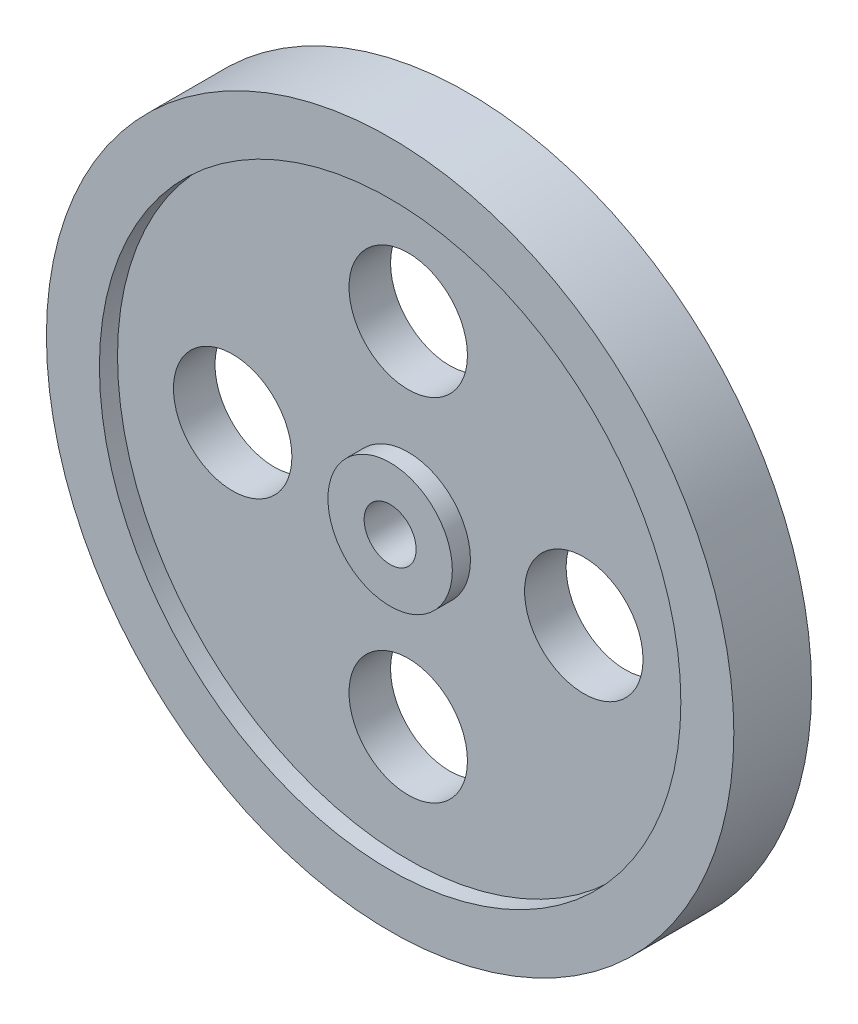
ISO-10303-21;
HEADER;
FILE_DESCRIPTION(('STEP AP214'),'2;1');
FILE_NAME('part.step','',(''),(''),'','','');
FILE_SCHEMA(('AUTOMOTIVE_DESIGN { 1 0 10303 214 1 1 1 1 }'));
ENDSEC;
DATA;
#1=APPLICATION_CONTEXT('core data for automotive mechanical design processes');
#2=APPLICATION_PROTOCOL_DEFINITION('international standard','automotive_design',2000,#1);
#3=PRODUCT_CONTEXT('',#1,'mechanical');
#4=PRODUCT('Part','Part','',(#3));
#5=PRODUCT_RELATED_PRODUCT_CATEGORY('part','',(#4));
#6=PRODUCT_DEFINITION_FORMATION('','',#4);
#7=PRODUCT_DEFINITION_CONTEXT('part definition',#1,'design');
#8=PRODUCT_DEFINITION('design','',#6,#7);
#9=PRODUCT_DEFINITION_SHAPE('','',#8);
#10=(LENGTH_UNIT() NAMED_UNIT(*) SI_UNIT(.MILLI.,.METRE.));
#11=(NAMED_UNIT(*) PLANE_ANGLE_UNIT() SI_UNIT($,.RADIAN.));
#12=(NAMED_UNIT(*) SI_UNIT($,.STERADIAN.) SOLID_ANGLE_UNIT());
#13=UNCERTAINTY_MEASURE_WITH_UNIT(LENGTH_MEASURE(1.E-05),#10,'distance_accuracy_value','');
#14=(GEOMETRIC_REPRESENTATION_CONTEXT(3) GLOBAL_UNCERTAINTY_ASSIGNED_CONTEXT((#13)) GLOBAL_UNIT_ASSIGNED_CONTEXT((#10,
#11,#12)) REPRESENTATION_CONTEXT('',''));
#15=CARTESIAN_POINT('',(0.,0.,0.));
#16=DIRECTION('',(0.,0.,1.));
#17=DIRECTION('',(1.,0.,0.));
#18=AXIS2_PLACEMENT_3D('',#15,#16,#17);
#19=CARTESIAN_POINT('',(0.,0.,-2.79));
#20=DIRECTION('',(0.,0.,1.));
#21=DIRECTION('',(1.,0.,0.));
#22=AXIS2_PLACEMENT_3D('',#19,#20,#21);
#23=PLANE('',#22);
#24=CARTESIAN_POINT('',(0.,0.,-2.79));
#25=DIRECTION('',(0.,0.,1.));
#26=DIRECTION('',(1.,0.,0.));
#27=AXIS2_PLACEMENT_3D('',#24,#25,#26);
#28=CIRCLE('',#27,1.8669);
#29=CARTESIAN_POINT('',(1.8669,0.,-2.79));
#30=VERTEX_POINT('',#29);
#31=EDGE_CURVE('E62',#30,#30,#28,.T.);
#32=ORIENTED_EDGE('',*,*,#31,.T.);
#33=EDGE_LOOP('',(#32));
#34=FACE_BOUND('',#33,.T.);
#35=CARTESIAN_POINT('',(0.,0.,-2.79));
#36=DIRECTION('',(0.,0.,1.));
#37=DIRECTION('',(1.,0.,0.));
#38=AXIS2_PLACEMENT_3D('',#35,#36,#37);
#39=CIRCLE('',#38,4.465);
#40=CARTESIAN_POINT('',(4.465,0.,-2.79));
#41=VERTEX_POINT('',#40);
#42=EDGE_CURVE('E121',#41,#41,#39,.T.);
#43=ORIENTED_EDGE('',*,*,#42,.F.);
#44=EDGE_LOOP('',(#43));
#45=FACE_BOUND('',#44,.T.);
#46=ADVANCED_FACE('F43',(#34,#45),#23,.F.);
#47=CARTESIAN_POINT('',(-12.6,1.3197799460827E-13,-2.79));
#48=DIRECTION('',(0.,0.,1.));
#49=DIRECTION('',(1.,0.,0.));
#50=AXIS2_PLACEMENT_3D('',#47,#48,#49);
#51=CYLINDRICAL_SURFACE('',#50,4.25);
#52=CARTESIAN_POINT('',(-12.6,1.3197799460827E-13,1.49));
#53=DIRECTION('',(0.,0.,1.));
#54=DIRECTION('',(1.,0.,0.));
#55=AXIS2_PLACEMENT_3D('',#52,#53,#54);
#56=CIRCLE('',#55,4.25);
#57=CARTESIAN_POINT('',(-8.35,1.3197799460827E-13,1.49));
#58=VERTEX_POINT('',#57);
#59=EDGE_CURVE('E85',#58,#58,#56,.T.);
#60=ORIENTED_EDGE('',*,*,#59,.T.);
#61=EDGE_LOOP('',(#60));
#62=FACE_BOUND('',#61,.T.);
#63=CARTESIAN_POINT('',(-12.6,1.3197799460827E-13,-1.49));
#64=DIRECTION('',(0.,0.,-1.));
#65=DIRECTION('',(-1.,0.,0.));
#66=AXIS2_PLACEMENT_3D('',#63,#64,#65);
#67=CIRCLE('',#66,4.25);
#68=CARTESIAN_POINT('',(-16.85,1.3197799460827E-13,-1.49));
#69=VERTEX_POINT('',#68);
#70=EDGE_CURVE('E90',#69,#69,#67,.F.);
#71=ORIENTED_EDGE('',*,*,#70,.F.);
#72=EDGE_LOOP('',(#71));
#73=FACE_BOUND('',#72,.T.);
#74=ADVANCED_FACE('F140',(#62,#73),#51,.F.);
#75=CARTESIAN_POINT('',(0.,-12.6,-2.79));
#76=DIRECTION('',(0.,0.,1.));
#77=DIRECTION('',(1.,0.,0.));
#78=AXIS2_PLACEMENT_3D('',#75,#76,#77);
#79=CYLINDRICAL_SURFACE('',#78,4.25);
#80=CARTESIAN_POINT('',(0.,-12.6,1.49));
#81=DIRECTION('',(0.,0.,1.));
#82=DIRECTION('',(1.,0.,0.));
#83=AXIS2_PLACEMENT_3D('',#80,#81,#82);
#84=CIRCLE('',#83,4.25);
#85=CARTESIAN_POINT('',(4.24999999999991,-12.6,1.49));
#86=VERTEX_POINT('',#85);
#87=EDGE_CURVE('E89',#86,#86,#84,.T.);
#88=ORIENTED_EDGE('',*,*,#87,.T.);
#89=EDGE_LOOP('',(#88));
#90=FACE_BOUND('',#89,.T.);
#91=CARTESIAN_POINT('',(0.,-12.6,-1.49));
#92=DIRECTION('',(0.,0.,-1.));
#93=DIRECTION('',(-1.,0.,0.));
#94=AXIS2_PLACEMENT_3D('',#91,#92,#93);
#95=CIRCLE('',#94,4.25);
#96=CARTESIAN_POINT('',(-4.25000000000009,-12.6,-1.49));
#97=VERTEX_POINT('',#96);
#98=EDGE_CURVE('E104',#97,#97,#95,.F.);
#99=ORIENTED_EDGE('',*,*,#98,.F.);
#100=EDGE_LOOP('',(#99));
#101=FACE_BOUND('',#100,.T.);
#102=ADVANCED_FACE('F148',(#90,#101),#79,.F.);
#103=CARTESIAN_POINT('',(12.6,0.,-2.79));
#104=DIRECTION('',(0.,0.,1.));
#105=DIRECTION('',(1.,0.,0.));
#106=AXIS2_PLACEMENT_3D('',#103,#104,#105);
#107=CYLINDRICAL_SURFACE('',#106,4.25);
#108=CARTESIAN_POINT('',(12.6,0.,1.49));
#109=DIRECTION('',(0.,0.,1.));
#110=DIRECTION('',(1.,0.,0.));
#111=AXIS2_PLACEMENT_3D('',#108,#109,#110);
#112=CIRCLE('',#111,4.25);
#113=CARTESIAN_POINT('',(16.85,0.,1.49));
#114=VERTEX_POINT('',#113);
#115=EDGE_CURVE('E94',#114,#114,#112,.T.);
#116=ORIENTED_EDGE('',*,*,#115,.T.);
#117=EDGE_LOOP('',(#116));
#118=FACE_BOUND('',#117,.T.);
#119=CARTESIAN_POINT('',(12.6,0.,-1.49));
#120=DIRECTION('',(0.,0.,-1.));
#121=DIRECTION('',(-1.,0.,0.));
#122=AXIS2_PLACEMENT_3D('',#119,#120,#121);
#123=CIRCLE('',#122,4.25);
#124=CARTESIAN_POINT('',(8.35,0.,-1.49));
#125=VERTEX_POINT('',#124);
#126=EDGE_CURVE('E108',#125,#125,#123,.F.);
#127=ORIENTED_EDGE('',*,*,#126,.F.);
#128=EDGE_LOOP('',(#127));
#129=FACE_BOUND('',#128,.T.);
#130=ADVANCED_FACE('F182',(#118,#129),#107,.F.);
#131=CARTESIAN_POINT('',(0.,12.6,-2.79));
#132=DIRECTION('',(0.,0.,1.));
#133=DIRECTION('',(1.,0.,0.));
#134=AXIS2_PLACEMENT_3D('',#131,#132,#133);
#135=CYLINDRICAL_SURFACE('',#134,4.25);
#136=CARTESIAN_POINT('',(0.,12.6,1.49));
#137=DIRECTION('',(0.,0.,1.));
#138=DIRECTION('',(1.,0.,0.));
#139=AXIS2_PLACEMENT_3D('',#136,#137,#138);
#140=CIRCLE('',#139,4.25);
#141=CARTESIAN_POINT('',(4.25,12.6,1.49));
#142=VERTEX_POINT('',#141);
#143=EDGE_CURVE('E81',#142,#142,#140,.T.);
#144=ORIENTED_EDGE('',*,*,#143,.T.);
#145=EDGE_LOOP('',(#144));
#146=FACE_BOUND('',#145,.T.);
#147=CARTESIAN_POINT('',(0.,12.6,-1.49));
#148=DIRECTION('',(0.,0.,-1.));
#149=DIRECTION('',(-1.,0.,0.));
#150=AXIS2_PLACEMENT_3D('',#147,#148,#149);
#151=CIRCLE('',#150,4.25);
#152=CARTESIAN_POINT('',(-4.25,12.6,-1.49));
#153=VERTEX_POINT('',#152);
#154=EDGE_CURVE('E47',#153,#153,#151,.F.);
#155=ORIENTED_EDGE('',*,*,#154,.F.);
#156=EDGE_LOOP('',(#155));
#157=FACE_BOUND('',#156,.T.);
#158=ADVANCED_FACE('F179',(#146,#157),#135,.F.);
#159=CARTESIAN_POINT('',(0.,0.,2.79));
#160=DIRECTION('',(0.,0.,1.));
#161=DIRECTION('',(1.,0.,0.));
#162=AXIS2_PLACEMENT_3D('',#159,#160,#161);
#163=PLANE('',#162);
#164=CARTESIAN_POINT('',(0.,0.,2.79));
#165=DIRECTION('',(0.,0.,1.));
#166=DIRECTION('',(1.,0.,0.));
#167=AXIS2_PLACEMENT_3D('',#164,#165,#166);
#168=CIRCLE('',#167,1.8669);
#169=CARTESIAN_POINT('',(1.8669,0.,2.79));
#170=VERTEX_POINT('',#169);
#171=EDGE_CURVE('E60',#170,#170,#168,.T.);
#172=ORIENTED_EDGE('',*,*,#171,.F.);
#173=EDGE_LOOP('',(#172));
#174=FACE_BOUND('',#173,.T.);
#175=CARTESIAN_POINT('',(0.,0.,2.79));
#176=DIRECTION('',(0.,0.,1.));
#177=DIRECTION('',(1.,0.,0.));
#178=AXIS2_PLACEMENT_3D('',#175,#176,#177);
#179=CIRCLE('',#178,4.465);
#180=CARTESIAN_POINT('',(4.465,0.,2.79));
#181=VERTEX_POINT('',#180);
#182=EDGE_CURVE('E77',#181,#181,#179,.T.);
#183=ORIENTED_EDGE('',*,*,#182,.T.);
#184=EDGE_LOOP('',(#183));
#185=FACE_BOUND('',#184,.T.);
#186=ADVANCED_FACE('F161',(#174,#185),#163,.T.);
#187=CARTESIAN_POINT('',(0.,0.,2.79));
#188=DIRECTION('',(0.,0.,1.));
#189=DIRECTION('',(1.,0.,0.));
#190=AXIS2_PLACEMENT_3D('',#187,#188,#189);
#191=CIRCLE('',#190,20.865);
#192=CARTESIAN_POINT('',(20.865,0.,2.79));
#193=VERTEX_POINT('',#192);
#194=EDGE_CURVE('E70',#193,#193,#191,.T.);
#195=ORIENTED_EDGE('',*,*,#194,.F.);
#196=EDGE_LOOP('',(#195));
#197=FACE_BOUND('',#196,.T.);
#198=CARTESIAN_POINT('',(0.,0.,2.79));
#199=DIRECTION('',(0.,0.,1.));
#200=DIRECTION('',(1.,0.,0.));
#201=AXIS2_PLACEMENT_3D('',#198,#199,#200);
#202=CIRCLE('',#201,24.66826923);
#203=CARTESIAN_POINT('',(24.66826923,0.,2.79));
#204=VERTEX_POINT('',#203);
#205=EDGE_CURVE('E10',#204,#204,#202,.T.);
#206=ORIENTED_EDGE('',*,*,#205,.T.);
#207=EDGE_LOOP('',(#206));
#208=FACE_BOUND('',#207,.T.);
#209=ADVANCED_FACE('F153',(#197,#208),#163,.T.);
#210=CARTESIAN_POINT('',(0.,0.,-2.79));
#211=DIRECTION('',(0.,0.,1.));
#212=DIRECTION('',(1.,0.,0.));
#213=AXIS2_PLACEMENT_3D('',#210,#211,#212);
#214=CIRCLE('',#213,20.865);
#215=CARTESIAN_POINT('',(20.865,0.,-2.79));
#216=VERTEX_POINT('',#215);
#217=EDGE_CURVE('E112',#216,#216,#214,.T.);
#218=ORIENTED_EDGE('',*,*,#217,.T.);
#219=EDGE_LOOP('',(#218));
#220=FACE_BOUND('',#219,.T.);
#221=CARTESIAN_POINT('',(0.,0.,-2.79));
#222=DIRECTION('',(0.,0.,1.));
#223=DIRECTION('',(1.,0.,0.));
#224=AXIS2_PLACEMENT_3D('',#221,#222,#223);
#225=CIRCLE('',#224,24.66826923);
#226=CARTESIAN_POINT('',(24.66826923,0.,-2.79));
#227=VERTEX_POINT('',#226);
#228=EDGE_CURVE('E52',#227,#227,#225,.T.);
#229=ORIENTED_EDGE('',*,*,#228,.F.);
#230=EDGE_LOOP('',(#229));
#231=FACE_BOUND('',#230,.T.);
#232=ADVANCED_FACE('F142',(#220,#231),#23,.F.);
#233=CARTESIAN_POINT('',(0.,0.,2.79));
#234=DIRECTION('',(0.,0.,-1.));
#235=DIRECTION('',(-1.,0.,0.));
#236=AXIS2_PLACEMENT_3D('',#233,#234,#235);
#237=CYLINDRICAL_SURFACE('',#236,24.66826923);
#238=ORIENTED_EDGE('',*,*,#205,.F.);
#239=EDGE_LOOP('',(#238));
#240=FACE_BOUND('',#239,.T.);
#241=ORIENTED_EDGE('',*,*,#228,.T.);
#242=EDGE_LOOP('',(#241));
#243=FACE_BOUND('',#242,.T.);
#244=ADVANCED_FACE('F45',(#240,#243),#237,.T.);
#245=CARTESIAN_POINT('',(0.,0.,2.79));
#246=DIRECTION('',(0.,0.,-1.));
#247=DIRECTION('',(-1.,0.,0.));
#248=AXIS2_PLACEMENT_3D('',#245,#246,#247);
#249=CYLINDRICAL_SURFACE('',#248,1.8669);
#250=ORIENTED_EDGE('',*,*,#171,.T.);
#251=EDGE_LOOP('',(#250));
#252=FACE_BOUND('',#251,.T.);
#253=ORIENTED_EDGE('',*,*,#31,.F.);
#254=EDGE_LOOP('',(#253));
#255=FACE_BOUND('',#254,.T.);
#256=ADVANCED_FACE('F158',(#252,#255),#249,.F.);
#257=CARTESIAN_POINT('',(0.,0.,1.49));
#258=DIRECTION('',(0.,0.,1.));
#259=DIRECTION('',(1.,0.,0.));
#260=AXIS2_PLACEMENT_3D('',#257,#258,#259);
#261=CYLINDRICAL_SURFACE('',#260,20.865);
#262=CARTESIAN_POINT('',(0.,0.,1.49));
#263=DIRECTION('',(0.,0.,1.));
#264=DIRECTION('',(1.,0.,0.));
#265=AXIS2_PLACEMENT_3D('',#262,#263,#264);
#266=CIRCLE('',#265,20.865);
#267=CARTESIAN_POINT('',(20.865,0.,1.49));
#268=VERTEX_POINT('',#267);
#269=EDGE_CURVE('E66',#268,#268,#266,.T.);
#270=ORIENTED_EDGE('',*,*,#269,.F.);
#271=EDGE_LOOP('',(#270));
#272=FACE_BOUND('',#271,.T.);
#273=ORIENTED_EDGE('',*,*,#194,.T.);
#274=EDGE_LOOP('',(#273));
#275=FACE_BOUND('',#274,.T.);
#276=ADVANCED_FACE('F195',(#272,#275),#261,.F.);
#277=CARTESIAN_POINT('',(0.,0.,1.49));
#278=DIRECTION('',(0.,0.,1.));
#279=DIRECTION('',(1.,0.,0.));
#280=AXIS2_PLACEMENT_3D('',#277,#278,#279);
#281=PLANE('',#280);
#282=ORIENTED_EDGE('',*,*,#143,.F.);
#283=EDGE_LOOP('',(#282));
#284=FACE_BOUND('',#283,.T.);
#285=ORIENTED_EDGE('',*,*,#115,.F.);
#286=EDGE_LOOP('',(#285));
#287=FACE_BOUND('',#286,.T.);
#288=ORIENTED_EDGE('',*,*,#87,.F.);
#289=EDGE_LOOP('',(#288));
#290=FACE_BOUND('',#289,.T.);
#291=ORIENTED_EDGE('',*,*,#59,.F.);
#292=EDGE_LOOP('',(#291));
#293=FACE_BOUND('',#292,.T.);
#294=CARTESIAN_POINT('',(0.,0.,1.49));
#295=DIRECTION('',(0.,0.,1.));
#296=DIRECTION('',(1.,0.,0.));
#297=AXIS2_PLACEMENT_3D('',#294,#295,#296);
#298=CIRCLE('',#297,4.465);
#299=CARTESIAN_POINT('',(4.465,0.,1.49));
#300=VERTEX_POINT('',#299);
#301=EDGE_CURVE('E73',#300,#300,#298,.T.);
#302=ORIENTED_EDGE('',*,*,#301,.F.);
#303=EDGE_LOOP('',(#302));
#304=FACE_BOUND('',#303,.T.);
#305=ORIENTED_EDGE('',*,*,#269,.T.);
#306=EDGE_LOOP('',(#305));
#307=FACE_BOUND('',#306,.T.);
#308=ADVANCED_FACE('F192',(#284,#287,#290,#293,#304,#307),#281,.T.);
#309=CARTESIAN_POINT('',(0.,0.,1.49));
#310=DIRECTION('',(0.,0.,1.));
#311=DIRECTION('',(1.,0.,0.));
#312=AXIS2_PLACEMENT_3D('',#309,#310,#311);
#313=CYLINDRICAL_SURFACE('',#312,4.465);
#314=ORIENTED_EDGE('',*,*,#301,.T.);
#315=EDGE_LOOP('',(#314));
#316=FACE_BOUND('',#315,.T.);
#317=ORIENTED_EDGE('',*,*,#182,.F.);
#318=EDGE_LOOP('',(#317));
#319=FACE_BOUND('',#318,.T.);
#320=ADVANCED_FACE('F175',(#316,#319),#313,.T.);
#321=CARTESIAN_POINT('',(0.,0.,-1.49));
#322=DIRECTION('',(0.,0.,-1.));
#323=DIRECTION('',(1.,0.,0.));
#324=AXIS2_PLACEMENT_3D('',#321,#322,#323);
#325=PLANE('',#324);
#326=CARTESIAN_POINT('',(0.,0.,-1.49));
#327=DIRECTION('',(0.,0.,1.));
#328=DIRECTION('',(1.,0.,0.));
#329=AXIS2_PLACEMENT_3D('',#326,#327,#328);
#330=CIRCLE('',#329,20.865);
#331=CARTESIAN_POINT('',(20.865,0.,-1.49));
#332=VERTEX_POINT('',#331);
#333=EDGE_CURVE('E116',#332,#332,#330,.T.);
#334=ORIENTED_EDGE('',*,*,#333,.F.);
#335=EDGE_LOOP('',(#334));
#336=FACE_BOUND('',#335,.T.);
#337=CARTESIAN_POINT('',(0.,0.,-1.49));
#338=DIRECTION('',(0.,0.,1.));
#339=DIRECTION('',(1.,0.,0.));
#340=AXIS2_PLACEMENT_3D('',#337,#338,#339);
#341=CIRCLE('',#340,4.465);
#342=CARTESIAN_POINT('',(4.465,0.,-1.49));
#343=VERTEX_POINT('',#342);
#344=EDGE_CURVE('E117',#343,#343,#341,.T.);
#345=ORIENTED_EDGE('',*,*,#344,.T.);
#346=EDGE_LOOP('',(#345));
#347=FACE_BOUND('',#346,.T.);
#348=ORIENTED_EDGE('',*,*,#154,.T.);
#349=EDGE_LOOP('',(#348));
#350=FACE_BOUND('',#349,.T.);
#351=ORIENTED_EDGE('',*,*,#126,.T.);
#352=EDGE_LOOP('',(#351));
#353=FACE_BOUND('',#352,.T.);
#354=ORIENTED_EDGE('',*,*,#98,.T.);
#355=EDGE_LOOP('',(#354));
#356=FACE_BOUND('',#355,.T.);
#357=ORIENTED_EDGE('',*,*,#70,.T.);
#358=EDGE_LOOP('',(#357));
#359=FACE_BOUND('',#358,.T.);
#360=ADVANCED_FACE('F129',(#336,#347,#350,#353,#356,#359),#325,.T.);
#361=CARTESIAN_POINT('',(0.,0.,-1.49));
#362=DIRECTION('',(0.,0.,-1.));
#363=DIRECTION('',(-1.,0.,0.));
#364=AXIS2_PLACEMENT_3D('',#361,#362,#363);
#365=CYLINDRICAL_SURFACE('',#364,20.865);
#366=ORIENTED_EDGE('',*,*,#333,.T.);
#367=EDGE_LOOP('',(#366));
#368=FACE_BOUND('',#367,.T.);
#369=ORIENTED_EDGE('',*,*,#217,.F.);
#370=EDGE_LOOP('',(#369));
#371=FACE_BOUND('',#370,.T.);
#372=ADVANCED_FACE('F135',(#368,#371),#365,.F.);
#373=CARTESIAN_POINT('',(0.,0.,-1.49));
#374=DIRECTION('',(0.,0.,-1.));
#375=DIRECTION('',(-1.,0.,0.));
#376=AXIS2_PLACEMENT_3D('',#373,#374,#375);
#377=CYLINDRICAL_SURFACE('',#376,4.465);
#378=ORIENTED_EDGE('',*,*,#344,.F.);
#379=EDGE_LOOP('',(#378));
#380=FACE_BOUND('',#379,.T.);
#381=ORIENTED_EDGE('',*,*,#42,.T.);
#382=EDGE_LOOP('',(#381));
#383=FACE_BOUND('',#382,.T.);
#384=ADVANCED_FACE('F132',(#380,#383),#377,.T.);
#385=CLOSED_SHELL('',(#46,#74,#102,#130,#158,#186,#209,#232,#244,#256,#276,#308,#320,#360,#372,#384));
#386=MANIFOLD_SOLID_BREP('B2',#385);
#387=ADVANCED_BREP_SHAPE_REPRESENTATION('',(#18,#386),#14);
#388=SHAPE_DEFINITION_REPRESENTATION(#9,#387);
ENDSEC;
END-ISO-10303-21;
